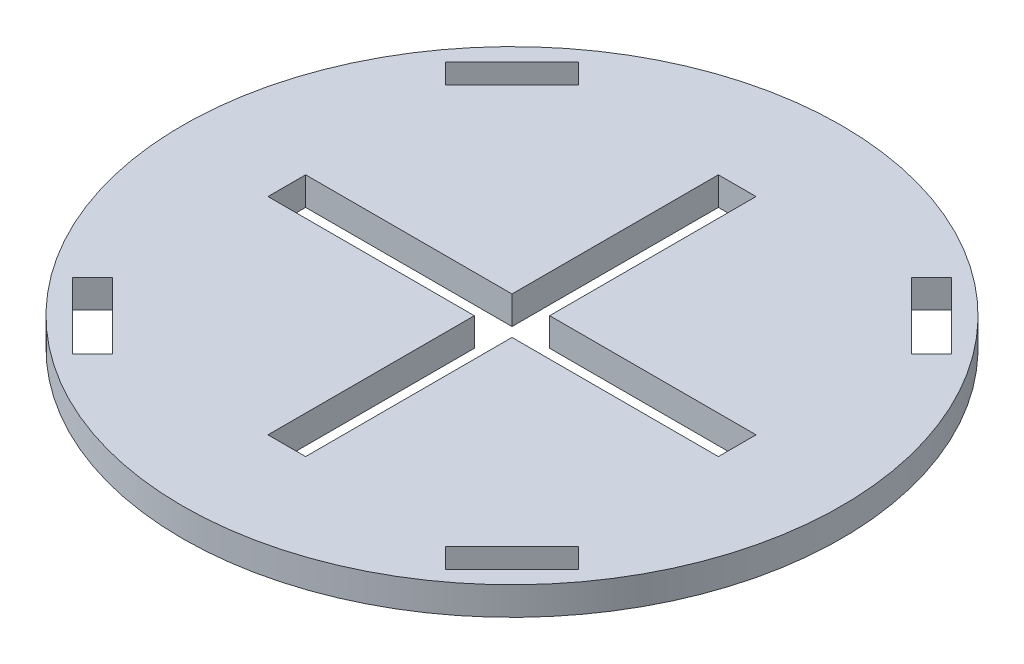
ISO-10303-21;
HEADER;
FILE_DESCRIPTION(('STEP AP214'),'2;1');
FILE_NAME('part.step','',(''),(''),'','','');
FILE_SCHEMA(('AUTOMOTIVE_DESIGN { 1 0 10303 214 1 1 1 1 }'));
ENDSEC;
DATA;
#1=APPLICATION_CONTEXT('core data for automotive mechanical design processes');
#2=APPLICATION_PROTOCOL_DEFINITION('international standard','automotive_design',2000,#1);
#3=PRODUCT_CONTEXT('',#1,'mechanical');
#4=PRODUCT('Part','Part','',(#3));
#5=PRODUCT_RELATED_PRODUCT_CATEGORY('part','',(#4));
#6=PRODUCT_DEFINITION_FORMATION('','',#4);
#7=PRODUCT_DEFINITION_CONTEXT('part definition',#1,'design');
#8=PRODUCT_DEFINITION('design','',#6,#7);
#9=PRODUCT_DEFINITION_SHAPE('','',#8);
#10=(LENGTH_UNIT() NAMED_UNIT(*) SI_UNIT(.MILLI.,.METRE.));
#11=(NAMED_UNIT(*) PLANE_ANGLE_UNIT() SI_UNIT($,.RADIAN.));
#12=(NAMED_UNIT(*) SI_UNIT($,.STERADIAN.) SOLID_ANGLE_UNIT());
#13=UNCERTAINTY_MEASURE_WITH_UNIT(LENGTH_MEASURE(1.E-05),#10,'distance_accuracy_value','');
#14=(GEOMETRIC_REPRESENTATION_CONTEXT(3) GLOBAL_UNCERTAINTY_ASSIGNED_CONTEXT((#13)) GLOBAL_UNIT_ASSIGNED_CONTEXT((#10,
#11,#12)) REPRESENTATION_CONTEXT('',''));
#15=CARTESIAN_POINT('',(0.,0.,0.));
#16=DIRECTION('',(0.,0.,1.));
#17=DIRECTION('',(1.,0.,0.));
#18=AXIS2_PLACEMENT_3D('',#15,#16,#17);
#19=CARTESIAN_POINT('',(0.,3.,0.));
#20=DIRECTION('',(0.,-1.,0.));
#21=DIRECTION('',(0.,0.,-1.));
#22=AXIS2_PLACEMENT_3D('',#19,#20,#21);
#23=CYLINDRICAL_SURFACE('',#22,35.);
#24=CARTESIAN_POINT('',(0.,3.,0.));
#25=DIRECTION('',(0.,1.,0.));
#26=DIRECTION('',(0.,0.,1.));
#27=AXIS2_PLACEMENT_3D('',#24,#25,#26);
#28=CIRCLE('',#27,35.);
#29=CARTESIAN_POINT('',(0.,3.,35.));
#30=VERTEX_POINT('',#29);
#31=EDGE_CURVE('E11',#30,#30,#28,.T.);
#32=ORIENTED_EDGE('',*,*,#31,.F.);
#33=EDGE_LOOP('',(#32));
#34=FACE_BOUND('',#33,.T.);
#35=CARTESIAN_POINT('',(0.,0.,0.));
#36=DIRECTION('',(0.,1.,0.));
#37=DIRECTION('',(0.,0.,1.));
#38=AXIS2_PLACEMENT_3D('',#35,#36,#37);
#39=CIRCLE('',#38,35.);
#40=CARTESIAN_POINT('',(0.,0.,35.));
#41=VERTEX_POINT('',#40);
#42=EDGE_CURVE('E36',#41,#41,#39,.T.);
#43=ORIENTED_EDGE('',*,*,#42,.T.);
#44=EDGE_LOOP('',(#43));
#45=FACE_BOUND('',#44,.T.);
#46=ADVANCED_FACE('F33',(#34,#45),#23,.T.);
#47=CARTESIAN_POINT('',(0.,3.,0.));
#48=DIRECTION('',(0.,1.,0.));
#49=DIRECTION('',(0.,0.,1.));
#50=AXIS2_PLACEMENT_3D('',#47,#48,#49);
#51=PLANE('',#50);
#52=DIRECTION('',(0.707106781186539,0.,0.707106781186556));
#53=VECTOR('',#52,1.);
#54=CARTESIAN_POINT('',(-26.8700576850886,3.,-19.7989898732236));
#55=LINE('',#54,#53);
#56=CARTESIAN_POINT('',(-26.8700576850886,3.,-19.7989898732236));
#57=VERTEX_POINT('',#56);
#58=CARTESIAN_POINT('',(-24.748737341529,3.,-17.677669529664));
#59=VERTEX_POINT('',#58);
#60=EDGE_CURVE('E47',#57,#59,#55,.T.);
#61=ORIENTED_EDGE('',*,*,#60,.F.);
#62=DIRECTION('',(-0.707106781186555,0.,0.70710678118654));
#63=VECTOR('',#62,1.);
#64=CARTESIAN_POINT('',(-26.8700576850886,3.,-19.7989898732236));
#65=LINE('',#64,#63);
#66=CARTESIAN_POINT('',(-19.798989873223,3.,-26.870057685089));
#67=VERTEX_POINT('',#66);
#68=EDGE_CURVE('E296',#67,#57,#65,.T.);
#69=ORIENTED_EDGE('',*,*,#68,.F.);
#70=DIRECTION('',(-0.70710678118654,0.,-0.707106781186555));
#71=VECTOR('',#70,1.);
#72=CARTESIAN_POINT('',(-19.798989873223,3.,-26.870057685089));
#73=LINE('',#72,#71);
#74=CARTESIAN_POINT('',(-17.6776695296634,3.,-24.7487373415293));
#75=VERTEX_POINT('',#74);
#76=EDGE_CURVE('E310',#75,#67,#73,.T.);
#77=ORIENTED_EDGE('',*,*,#76,.F.);
#78=DIRECTION('',(0.707106781186555,0.,-0.70710678118654));
#79=VECTOR('',#78,1.);
#80=CARTESIAN_POINT('',(-24.748737341529,3.,-17.677669529664));
#81=LINE('',#80,#79);
#82=EDGE_CURVE('E307',#59,#75,#81,.T.);
#83=ORIENTED_EDGE('',*,*,#82,.F.);
#84=EDGE_LOOP('',(#61,#69,#77,#83));
#85=FACE_BOUND('',#84,.T.);
#86=DIRECTION('',(0.707106781186553,0.,-0.707106781186542));
#87=VECTOR('',#86,1.);
#88=CARTESIAN_POINT('',(-19.7989898732235,3.,26.8700576850887));
#89=LINE('',#88,#87);
#90=CARTESIAN_POINT('',(-19.7989898732235,3.,26.8700576850887));
#91=VERTEX_POINT('',#90);
#92=CARTESIAN_POINT('',(-17.6776695296639,3.,24.748737341529));
#93=VERTEX_POINT('',#92);
#94=EDGE_CURVE('E55',#91,#93,#89,.T.);
#95=ORIENTED_EDGE('',*,*,#94,.F.);
#96=DIRECTION('',(0.707106781186543,0.,0.707106781186552));
#97=VECTOR('',#96,1.);
#98=CARTESIAN_POINT('',(-19.7989898732235,3.,26.8700576850887));
#99=LINE('',#98,#97);
#100=CARTESIAN_POINT('',(-26.8700576850889,3.,19.7989898732231));
#101=VERTEX_POINT('',#100);
#102=EDGE_CURVE('E266',#101,#91,#99,.T.);
#103=ORIENTED_EDGE('',*,*,#102,.F.);
#104=DIRECTION('',(-0.707106781186552,0.,0.707106781186543));
#105=VECTOR('',#104,1.);
#106=CARTESIAN_POINT('',(-26.8700576850889,3.,19.7989898732231));
#107=LINE('',#106,#105);
#108=CARTESIAN_POINT('',(-24.7487373415293,3.,17.6776695296635));
#109=VERTEX_POINT('',#108);
#110=EDGE_CURVE('E281',#109,#101,#107,.T.);
#111=ORIENTED_EDGE('',*,*,#110,.F.);
#112=DIRECTION('',(-0.707106781186543,0.,-0.707106781186552));
#113=VECTOR('',#112,1.);
#114=CARTESIAN_POINT('',(-17.6776695296639,3.,24.748737341529));
#115=LINE('',#114,#113);
#116=EDGE_CURVE('E277',#93,#109,#115,.T.);
#117=ORIENTED_EDGE('',*,*,#116,.F.);
#118=EDGE_LOOP('',(#95,#103,#111,#117));
#119=FACE_BOUND('',#118,.T.);
#120=DIRECTION('',(-0.707106781186545,0.,-0.70710678118655));
#121=VECTOR('',#120,1.);
#122=CARTESIAN_POINT('',(26.8700576850887,3.,19.7989898732234));
#123=LINE('',#122,#121);
#124=CARTESIAN_POINT('',(26.8700576850887,3.,19.7989898732234));
#125=VERTEX_POINT('',#124);
#126=CARTESIAN_POINT('',(24.7487373415291,3.,17.6776695296638));
#127=VERTEX_POINT('',#126);
#128=EDGE_CURVE('E224',#125,#127,#123,.T.);
#129=ORIENTED_EDGE('',*,*,#128,.F.);
#130=DIRECTION('',(0.70710678118655,0.,-0.707106781186545));
#131=VECTOR('',#130,1.);
#132=CARTESIAN_POINT('',(26.8700576850887,3.,19.7989898732234));
#133=LINE('',#132,#131);
#134=CARTESIAN_POINT('',(19.7989898732232,3.,26.8700576850889));
#135=VERTEX_POINT('',#134);
#136=EDGE_CURVE('E242',#135,#125,#133,.T.);
#137=ORIENTED_EDGE('',*,*,#136,.F.);
#138=DIRECTION('',(0.707106781186545,0.,0.70710678118655));
#139=VECTOR('',#138,1.);
#140=CARTESIAN_POINT('',(19.7989898732232,3.,26.8700576850889));
#141=LINE('',#140,#139);
#142=CARTESIAN_POINT('',(17.6776695296636,3.,24.7487373415292));
#143=VERTEX_POINT('',#142);
#144=EDGE_CURVE('E245',#143,#135,#141,.T.);
#145=ORIENTED_EDGE('',*,*,#144,.F.);
#146=DIRECTION('',(-0.70710678118655,0.,0.707106781186545));
#147=VECTOR('',#146,1.);
#148=CARTESIAN_POINT('',(24.7487373415291,3.,17.6776695296638));
#149=LINE('',#148,#147);
#150=EDGE_CURVE('E251',#127,#143,#149,.T.);
#151=ORIENTED_EDGE('',*,*,#150,.F.);
#152=EDGE_LOOP('',(#129,#137,#145,#151));
#153=FACE_BOUND('',#152,.T.);
#154=DIRECTION('',(-0.707106781186548,0.,0.707106781186547));
#155=VECTOR('',#154,1.);
#156=CARTESIAN_POINT('',(19.7989898732233,3.,-26.8700576850888));
#157=LINE('',#156,#155);
#158=CARTESIAN_POINT('',(19.7989898732233,3.,-26.8700576850888));
#159=VERTEX_POINT('',#158);
#160=CARTESIAN_POINT('',(17.6776695296637,3.,-24.7487373415292));
#161=VERTEX_POINT('',#160);
#162=EDGE_CURVE('E258',#159,#161,#157,.T.);
#163=ORIENTED_EDGE('',*,*,#162,.F.);
#164=DIRECTION('',(-0.707106781186548,0.,-0.707106781186547));
#165=VECTOR('',#164,1.);
#166=CARTESIAN_POINT('',(19.7989898732233,3.,-26.8700576850888));
#167=LINE('',#166,#165);
#168=CARTESIAN_POINT('',(26.8700576850888,3.,-19.7989898732233));
#169=VERTEX_POINT('',#168);
#170=EDGE_CURVE('E325',#169,#159,#167,.T.);
#171=ORIENTED_EDGE('',*,*,#170,.F.);
#172=DIRECTION('',(0.707106781186548,0.,-0.707106781186548));
#173=VECTOR('',#172,1.);
#174=CARTESIAN_POINT('',(26.8700576850888,3.,-19.7989898732233));
#175=LINE('',#174,#173);
#176=CARTESIAN_POINT('',(24.7487373415292,3.,-17.6776695296637));
#177=VERTEX_POINT('',#176);
#178=EDGE_CURVE('E339',#177,#169,#175,.T.);
#179=ORIENTED_EDGE('',*,*,#178,.F.);
#180=DIRECTION('',(0.707106781186548,0.,0.707106781186548));
#181=VECTOR('',#180,1.);
#182=CARTESIAN_POINT('',(17.6776695296637,3.,-24.7487373415292));
#183=LINE('',#182,#181);
#184=EDGE_CURVE('E336',#161,#177,#183,.T.);
#185=ORIENTED_EDGE('',*,*,#184,.F.);
#186=EDGE_LOOP('',(#163,#171,#179,#185));
#187=FACE_BOUND('',#186,.T.);
#188=DIRECTION('',(0.,0.,-1.));
#189=VECTOR('',#188,1.);
#190=CARTESIAN_POINT('',(2.,3.,2.00000000000003));
#191=LINE('',#190,#189);
#192=CARTESIAN_POINT('',(2.,3.,23.9165214862028));
#193=VERTEX_POINT('',#192);
#194=CARTESIAN_POINT('',(2.,3.,2.00000000000003));
#195=VERTEX_POINT('',#194);
#196=EDGE_CURVE('E346',#193,#195,#191,.T.);
#197=ORIENTED_EDGE('',*,*,#196,.F.);
#198=DIRECTION('',(1.,0.,0.));
#199=VECTOR('',#198,1.);
#200=CARTESIAN_POINT('',(-2.,3.,23.9165214862028));
#201=LINE('',#200,#199);
#202=CARTESIAN_POINT('',(-2.,3.,23.9165214862028));
#203=VERTEX_POINT('',#202);
#204=EDGE_CURVE('E357',#203,#193,#201,.T.);
#205=ORIENTED_EDGE('',*,*,#204,.F.);
#206=DIRECTION('',(0.,0.,1.));
#207=VECTOR('',#206,1.);
#208=CARTESIAN_POINT('',(-2.,3.,23.9165214862028));
#209=LINE('',#208,#207);
#210=CARTESIAN_POINT('',(-2.,3.,2.));
#211=VERTEX_POINT('',#210);
#212=EDGE_CURVE('E419',#211,#203,#209,.T.);
#213=ORIENTED_EDGE('',*,*,#212,.F.);
#214=DIRECTION('',(1.,0.,0.));
#215=VECTOR('',#214,1.);
#216=CARTESIAN_POINT('',(-2.,3.,2.));
#217=LINE('',#216,#215);
#218=CARTESIAN_POINT('',(-23.9165214862028,3.,2.));
#219=VERTEX_POINT('',#218);
#220=EDGE_CURVE('E416',#219,#211,#217,.T.);
#221=ORIENTED_EDGE('',*,*,#220,.F.);
#222=DIRECTION('',(0.,0.,1.));
#223=VECTOR('',#222,1.);
#224=CARTESIAN_POINT('',(-23.9165214862028,3.,2.));
#225=LINE('',#224,#223);
#226=CARTESIAN_POINT('',(-23.9165214862028,3.,-2.));
#227=VERTEX_POINT('',#226);
#228=EDGE_CURVE('E413',#227,#219,#225,.T.);
#229=ORIENTED_EDGE('',*,*,#228,.F.);
#230=DIRECTION('',(-1.,0.,0.));
#231=VECTOR('',#230,1.);
#232=CARTESIAN_POINT('',(-2.,3.,-2.));
#233=LINE('',#232,#231);
#234=CARTESIAN_POINT('',(-2.,3.,-2.));
#235=VERTEX_POINT('',#234);
#236=EDGE_CURVE('E410',#235,#227,#233,.T.);
#237=ORIENTED_EDGE('',*,*,#236,.F.);
#238=DIRECTION('',(0.,0.,1.));
#239=VECTOR('',#238,1.);
#240=CARTESIAN_POINT('',(-2.,3.,-23.9165214862028));
#241=LINE('',#240,#239);
#242=CARTESIAN_POINT('',(-2.,3.,-23.9165214862028));
#243=VERTEX_POINT('',#242);
#244=EDGE_CURVE('E407',#243,#235,#241,.T.);
#245=ORIENTED_EDGE('',*,*,#244,.F.);
#246=DIRECTION('',(-1.,0.,0.));
#247=VECTOR('',#246,1.);
#248=CARTESIAN_POINT('',(-2.,3.,-23.9165214862028));
#249=LINE('',#248,#247);
#250=CARTESIAN_POINT('',(2.,3.,-23.9165214862028));
#251=VERTEX_POINT('',#250);
#252=EDGE_CURVE('E404',#251,#243,#249,.T.);
#253=ORIENTED_EDGE('',*,*,#252,.F.);
#254=DIRECTION('',(0.,0.,-1.));
#255=VECTOR('',#254,1.);
#256=CARTESIAN_POINT('',(2.,3.,-23.9165214862028));
#257=LINE('',#256,#255);
#258=CARTESIAN_POINT('',(2.,3.,-2.00000000000003));
#259=VERTEX_POINT('',#258);
#260=EDGE_CURVE('E401',#259,#251,#257,.T.);
#261=ORIENTED_EDGE('',*,*,#260,.F.);
#262=DIRECTION('',(-1.,0.,0.));
#263=VECTOR('',#262,1.);
#264=CARTESIAN_POINT('',(2.,3.,-2.00000000000003));
#265=LINE('',#264,#263);
#266=CARTESIAN_POINT('',(23.9165214862028,3.,-2.00000000000002));
#267=VERTEX_POINT('',#266);
#268=EDGE_CURVE('E398',#267,#259,#265,.T.);
#269=ORIENTED_EDGE('',*,*,#268,.F.);
#270=DIRECTION('',(0.,0.,-1.));
#271=VECTOR('',#270,1.);
#272=CARTESIAN_POINT('',(23.9165214862028,3.,-2.00000000000002));
#273=LINE('',#272,#271);
#274=CARTESIAN_POINT('',(23.9165214862028,3.,2.00000000000002));
#275=VERTEX_POINT('',#274);
#276=EDGE_CURVE('E395',#275,#267,#273,.T.);
#277=ORIENTED_EDGE('',*,*,#276,.F.);
#278=DIRECTION('',(1.,0.,0.));
#279=VECTOR('',#278,1.);
#280=CARTESIAN_POINT('',(2.,3.,2.00000000000003));
#281=LINE('',#280,#279);
#282=EDGE_CURVE('E392',#195,#275,#281,.T.);
#283=ORIENTED_EDGE('',*,*,#282,.F.);
#284=EDGE_LOOP('',(#197,#205,#213,#221,#229,#237,#245,#253,#261,#269,#277,#283));
#285=FACE_BOUND('',#284,.T.);
#286=ORIENTED_EDGE('',*,*,#31,.T.);
#287=EDGE_LOOP('',(#286));
#288=FACE_BOUND('',#287,.T.);
#289=ADVANCED_FACE('F457',(#85,#119,#153,#187,#285,#288),#51,.T.);
#290=CARTESIAN_POINT('',(0.,0.,0.));
#291=DIRECTION('',(0.,1.,0.));
#292=DIRECTION('',(0.,0.,1.));
#293=AXIS2_PLACEMENT_3D('',#290,#291,#292);
#294=PLANE('',#293);
#295=DIRECTION('',(-0.707106781186555,0.,0.70710678118654));
#296=VECTOR('',#295,1.);
#297=CARTESIAN_POINT('',(-26.8700576850886,0.,-19.7989898732236));
#298=LINE('',#297,#296);
#299=CARTESIAN_POINT('',(-19.798989873223,0.,-26.870057685089));
#300=VERTEX_POINT('',#299);
#301=CARTESIAN_POINT('',(-26.8700576850886,0.,-19.7989898732236));
#302=VERTEX_POINT('',#301);
#303=EDGE_CURVE('E302',#300,#302,#298,.T.);
#304=ORIENTED_EDGE('',*,*,#303,.T.);
#305=DIRECTION('',(0.707106781186539,0.,0.707106781186556));
#306=VECTOR('',#305,1.);
#307=CARTESIAN_POINT('',(-26.8700576850886,0.,-19.7989898732236));
#308=LINE('',#307,#306);
#309=CARTESIAN_POINT('',(-24.748737341529,0.,-17.677669529664));
#310=VERTEX_POINT('',#309);
#311=EDGE_CURVE('E292',#302,#310,#308,.T.);
#312=ORIENTED_EDGE('',*,*,#311,.T.);
#313=DIRECTION('',(0.707106781186555,0.,-0.70710678118654));
#314=VECTOR('',#313,1.);
#315=CARTESIAN_POINT('',(-24.748737341529,0.,-17.677669529664));
#316=LINE('',#315,#314);
#317=CARTESIAN_POINT('',(-17.6776695296634,0.,-24.7487373415293));
#318=VERTEX_POINT('',#317);
#319=EDGE_CURVE('E295',#310,#318,#316,.T.);
#320=ORIENTED_EDGE('',*,*,#319,.T.);
#321=DIRECTION('',(-0.70710678118654,0.,-0.707106781186555));
#322=VECTOR('',#321,1.);
#323=CARTESIAN_POINT('',(-19.798989873223,0.,-26.870057685089));
#324=LINE('',#323,#322);
#325=EDGE_CURVE('E299',#318,#300,#324,.T.);
#326=ORIENTED_EDGE('',*,*,#325,.T.);
#327=EDGE_LOOP('',(#304,#312,#320,#326));
#328=FACE_BOUND('',#327,.T.);
#329=DIRECTION('',(0.707106781186543,0.,0.707106781186552));
#330=VECTOR('',#329,1.);
#331=CARTESIAN_POINT('',(-19.7989898732235,0.,26.8700576850887));
#332=LINE('',#331,#330);
#333=CARTESIAN_POINT('',(-26.8700576850889,0.,19.7989898732231));
#334=VERTEX_POINT('',#333);
#335=CARTESIAN_POINT('',(-19.7989898732235,0.,26.8700576850887));
#336=VERTEX_POINT('',#335);
#337=EDGE_CURVE('E272',#334,#336,#332,.T.);
#338=ORIENTED_EDGE('',*,*,#337,.T.);
#339=DIRECTION('',(0.707106781186553,0.,-0.707106781186542));
#340=VECTOR('',#339,1.);
#341=CARTESIAN_POINT('',(-19.7989898732235,0.,26.8700576850887));
#342=LINE('',#341,#340);
#343=CARTESIAN_POINT('',(-17.6776695296639,0.,24.748737341529));
#344=VERTEX_POINT('',#343);
#345=EDGE_CURVE('E262',#336,#344,#342,.T.);
#346=ORIENTED_EDGE('',*,*,#345,.T.);
#347=DIRECTION('',(-0.707106781186543,0.,-0.707106781186552));
#348=VECTOR('',#347,1.);
#349=CARTESIAN_POINT('',(-17.6776695296639,0.,24.748737341529));
#350=LINE('',#349,#348);
#351=CARTESIAN_POINT('',(-24.7487373415293,0.,17.6776695296635));
#352=VERTEX_POINT('',#351);
#353=EDGE_CURVE('E265',#344,#352,#350,.T.);
#354=ORIENTED_EDGE('',*,*,#353,.T.);
#355=DIRECTION('',(-0.707106781186552,0.,0.707106781186543));
#356=VECTOR('',#355,1.);
#357=CARTESIAN_POINT('',(-26.8700576850889,0.,19.7989898732231));
#358=LINE('',#357,#356);
#359=EDGE_CURVE('E269',#352,#334,#358,.T.);
#360=ORIENTED_EDGE('',*,*,#359,.T.);
#361=EDGE_LOOP('',(#338,#346,#354,#360));
#362=FACE_BOUND('',#361,.T.);
#363=DIRECTION('',(0.70710678118655,0.,-0.707106781186545));
#364=VECTOR('',#363,1.);
#365=CARTESIAN_POINT('',(26.8700576850887,0.,19.7989898732234));
#366=LINE('',#365,#364);
#367=CARTESIAN_POINT('',(19.7989898732232,0.,26.8700576850889));
#368=VERTEX_POINT('',#367);
#369=CARTESIAN_POINT('',(26.8700576850887,0.,19.7989898732234));
#370=VERTEX_POINT('',#369);
#371=EDGE_CURVE('E229',#368,#370,#366,.T.);
#372=ORIENTED_EDGE('',*,*,#371,.T.);
#373=DIRECTION('',(-0.707106781186545,0.,-0.70710678118655));
#374=VECTOR('',#373,1.);
#375=CARTESIAN_POINT('',(26.8700576850887,0.,19.7989898732234));
#376=LINE('',#375,#374);
#377=CARTESIAN_POINT('',(24.7487373415291,0.,17.6776695296638));
#378=VERTEX_POINT('',#377);
#379=EDGE_CURVE('E221',#370,#378,#376,.T.);
#380=ORIENTED_EDGE('',*,*,#379,.T.);
#381=DIRECTION('',(-0.70710678118655,0.,0.707106781186545));
#382=VECTOR('',#381,1.);
#383=CARTESIAN_POINT('',(24.7487373415291,0.,17.6776695296638));
#384=LINE('',#383,#382);
#385=CARTESIAN_POINT('',(17.6776695296636,0.,24.7487373415292));
#386=VERTEX_POINT('',#385);
#387=EDGE_CURVE('E233',#378,#386,#384,.T.);
#388=ORIENTED_EDGE('',*,*,#387,.T.);
#389=DIRECTION('',(0.707106781186545,0.,0.70710678118655));
#390=VECTOR('',#389,1.);
#391=CARTESIAN_POINT('',(19.7989898732232,0.,26.8700576850889));
#392=LINE('',#391,#390);
#393=EDGE_CURVE('E237',#386,#368,#392,.T.);
#394=ORIENTED_EDGE('',*,*,#393,.T.);
#395=EDGE_LOOP('',(#372,#380,#388,#394));
#396=FACE_BOUND('',#395,.T.);
#397=DIRECTION('',(-0.707106781186548,0.,-0.707106781186547));
#398=VECTOR('',#397,1.);
#399=CARTESIAN_POINT('',(19.7989898732233,0.,-26.8700576850888));
#400=LINE('',#399,#398);
#401=CARTESIAN_POINT('',(26.8700576850888,0.,-19.7989898732233));
#402=VERTEX_POINT('',#401);
#403=CARTESIAN_POINT('',(19.7989898732233,0.,-26.8700576850888));
#404=VERTEX_POINT('',#403);
#405=EDGE_CURVE('E331',#402,#404,#400,.T.);
#406=ORIENTED_EDGE('',*,*,#405,.T.);
#407=DIRECTION('',(-0.707106781186548,0.,0.707106781186547));
#408=VECTOR('',#407,1.);
#409=CARTESIAN_POINT('',(19.7989898732233,0.,-26.8700576850888));
#410=LINE('',#409,#408);
#411=CARTESIAN_POINT('',(17.6776695296637,0.,-24.7487373415292));
#412=VERTEX_POINT('',#411);
#413=EDGE_CURVE('E321',#404,#412,#410,.T.);
#414=ORIENTED_EDGE('',*,*,#413,.T.);
#415=DIRECTION('',(0.707106781186548,0.,0.707106781186548));
#416=VECTOR('',#415,1.);
#417=CARTESIAN_POINT('',(17.6776695296637,0.,-24.7487373415292));
#418=LINE('',#417,#416);
#419=CARTESIAN_POINT('',(24.7487373415292,0.,-17.6776695296637));
#420=VERTEX_POINT('',#419);
#421=EDGE_CURVE('E324',#412,#420,#418,.T.);
#422=ORIENTED_EDGE('',*,*,#421,.T.);
#423=DIRECTION('',(0.707106781186548,0.,-0.707106781186548));
#424=VECTOR('',#423,1.);
#425=CARTESIAN_POINT('',(26.8700576850888,0.,-19.7989898732233));
#426=LINE('',#425,#424);
#427=EDGE_CURVE('E328',#420,#402,#426,.T.);
#428=ORIENTED_EDGE('',*,*,#427,.T.);
#429=EDGE_LOOP('',(#406,#414,#422,#428));
#430=FACE_BOUND('',#429,.T.);
#431=DIRECTION('',(1.,0.,0.));
#432=VECTOR('',#431,1.);
#433=CARTESIAN_POINT('',(-2.,0.,23.9165214862028));
#434=LINE('',#433,#432);
#435=CARTESIAN_POINT('',(-2.,0.,23.9165214862028));
#436=VERTEX_POINT('',#435);
#437=CARTESIAN_POINT('',(2.,0.,23.9165214862028));
#438=VERTEX_POINT('',#437);
#439=EDGE_CURVE('E387',#436,#438,#434,.T.);
#440=ORIENTED_EDGE('',*,*,#439,.T.);
#441=DIRECTION('',(0.,0.,-1.));
#442=VECTOR('',#441,1.);
#443=CARTESIAN_POINT('',(2.,0.,2.00000000000003));
#444=LINE('',#443,#442);
#445=CARTESIAN_POINT('',(2.,0.,2.00000000000003));
#446=VERTEX_POINT('',#445);
#447=EDGE_CURVE('E353',#438,#446,#444,.T.);
#448=ORIENTED_EDGE('',*,*,#447,.T.);
#449=DIRECTION('',(1.,0.,0.));
#450=VECTOR('',#449,1.);
#451=CARTESIAN_POINT('',(2.,0.,2.00000000000003));
#452=LINE('',#451,#450);
#453=CARTESIAN_POINT('',(23.9165214862028,0.,2.00000000000002));
#454=VERTEX_POINT('',#453);
#455=EDGE_CURVE('E356',#446,#454,#452,.T.);
#456=ORIENTED_EDGE('',*,*,#455,.T.);
#457=DIRECTION('',(0.,0.,-1.));
#458=VECTOR('',#457,1.);
#459=CARTESIAN_POINT('',(23.9165214862028,0.,-2.00000000000002));
#460=LINE('',#459,#458);
#461=CARTESIAN_POINT('',(23.9165214862028,0.,-2.00000000000002));
#462=VERTEX_POINT('',#461);
#463=EDGE_CURVE('E360',#454,#462,#460,.T.);
#464=ORIENTED_EDGE('',*,*,#463,.T.);
#465=DIRECTION('',(-1.,0.,0.));
#466=VECTOR('',#465,1.);
#467=CARTESIAN_POINT('',(2.,0.,-2.00000000000003));
#468=LINE('',#467,#466);
#469=CARTESIAN_POINT('',(2.,0.,-2.00000000000003));
#470=VERTEX_POINT('',#469);
#471=EDGE_CURVE('E363',#462,#470,#468,.T.);
#472=ORIENTED_EDGE('',*,*,#471,.T.);
#473=DIRECTION('',(0.,0.,-1.));
#474=VECTOR('',#473,1.);
#475=CARTESIAN_POINT('',(2.,0.,-23.9165214862028));
#476=LINE('',#475,#474);
#477=CARTESIAN_POINT('',(2.,0.,-23.9165214862028));
#478=VERTEX_POINT('',#477);
#479=EDGE_CURVE('E366',#470,#478,#476,.T.);
#480=ORIENTED_EDGE('',*,*,#479,.T.);
#481=DIRECTION('',(-1.,0.,0.));
#482=VECTOR('',#481,1.);
#483=CARTESIAN_POINT('',(-2.,0.,-23.9165214862028));
#484=LINE('',#483,#482);
#485=CARTESIAN_POINT('',(-2.,0.,-23.9165214862028));
#486=VERTEX_POINT('',#485);
#487=EDGE_CURVE('E369',#478,#486,#484,.T.);
#488=ORIENTED_EDGE('',*,*,#487,.T.);
#489=DIRECTION('',(0.,0.,1.));
#490=VECTOR('',#489,1.);
#491=CARTESIAN_POINT('',(-2.,0.,-23.9165214862028));
#492=LINE('',#491,#490);
#493=CARTESIAN_POINT('',(-2.,0.,-2.));
#494=VERTEX_POINT('',#493);
#495=EDGE_CURVE('E372',#486,#494,#492,.T.);
#496=ORIENTED_EDGE('',*,*,#495,.T.);
#497=DIRECTION('',(-1.,0.,0.));
#498=VECTOR('',#497,1.);
#499=CARTESIAN_POINT('',(-2.,0.,-2.));
#500=LINE('',#499,#498);
#501=CARTESIAN_POINT('',(-23.9165214862028,0.,-2.));
#502=VERTEX_POINT('',#501);
#503=EDGE_CURVE('E375',#494,#502,#500,.T.);
#504=ORIENTED_EDGE('',*,*,#503,.T.);
#505=DIRECTION('',(0.,0.,1.));
#506=VECTOR('',#505,1.);
#507=CARTESIAN_POINT('',(-23.9165214862028,0.,2.));
#508=LINE('',#507,#506);
#509=CARTESIAN_POINT('',(-23.9165214862028,0.,2.));
#510=VERTEX_POINT('',#509);
#511=EDGE_CURVE('E378',#502,#510,#508,.T.);
#512=ORIENTED_EDGE('',*,*,#511,.T.);
#513=DIRECTION('',(1.,0.,0.));
#514=VECTOR('',#513,1.);
#515=CARTESIAN_POINT('',(-2.,0.,2.));
#516=LINE('',#515,#514);
#517=CARTESIAN_POINT('',(-2.,0.,2.));
#518=VERTEX_POINT('',#517);
#519=EDGE_CURVE('E381',#510,#518,#516,.T.);
#520=ORIENTED_EDGE('',*,*,#519,.T.);
#521=DIRECTION('',(0.,0.,1.));
#522=VECTOR('',#521,1.);
#523=CARTESIAN_POINT('',(-2.,0.,23.9165214862028));
#524=LINE('',#523,#522);
#525=EDGE_CURVE('E384',#518,#436,#524,.T.);
#526=ORIENTED_EDGE('',*,*,#525,.T.);
#527=EDGE_LOOP('',(#440,#448,#456,#464,#472,#480,#488,#496,#504,#512,#520,#526));
#528=FACE_BOUND('',#527,.T.);
#529=ORIENTED_EDGE('',*,*,#42,.F.);
#530=EDGE_LOOP('',(#529));
#531=FACE_BOUND('',#530,.T.);
#532=ADVANCED_FACE('F239',(#328,#362,#396,#430,#528,#531),#294,.F.);
#533=CARTESIAN_POINT('',(2.,0.,2.00000000000003));
#534=DIRECTION('',(1.,0.,0.));
#535=DIRECTION('',(0.,0.,-1.));
#536=AXIS2_PLACEMENT_3D('',#533,#534,#535);
#537=PLANE('',#536);
#538=ORIENTED_EDGE('',*,*,#196,.T.);
#539=DIRECTION('',(0.,1.,0.));
#540=VECTOR('',#539,1.);
#541=CARTESIAN_POINT('',(2.,0.,2.00000000000003));
#542=LINE('',#541,#540);
#543=EDGE_CURVE('E390',#446,#195,#542,.T.);
#544=ORIENTED_EDGE('',*,*,#543,.F.);
#545=ORIENTED_EDGE('',*,*,#447,.F.);
#546=DIRECTION('',(0.,1.,0.));
#547=VECTOR('',#546,1.);
#548=CARTESIAN_POINT('',(2.,0.,23.9165214862028));
#549=LINE('',#548,#547);
#550=EDGE_CURVE('E424',#438,#193,#549,.T.);
#551=ORIENTED_EDGE('',*,*,#550,.T.);
#552=EDGE_LOOP('',(#538,#544,#545,#551));
#553=FACE_BOUND('',#552,.T.);
#554=ADVANCED_FACE('F468',(#553),#537,.F.);
#555=CARTESIAN_POINT('',(-2.,0.,23.9165214862028));
#556=DIRECTION('',(0.,0.,1.));
#557=DIRECTION('',(1.,0.,0.));
#558=AXIS2_PLACEMENT_3D('',#555,#556,#557);
#559=PLANE('',#558);
#560=ORIENTED_EDGE('',*,*,#204,.T.);
#561=ORIENTED_EDGE('',*,*,#550,.F.);
#562=ORIENTED_EDGE('',*,*,#439,.F.);
#563=DIRECTION('',(0.,1.,0.));
#564=VECTOR('',#563,1.);
#565=CARTESIAN_POINT('',(-2.,0.,23.9165214862028));
#566=LINE('',#565,#564);
#567=EDGE_CURVE('E426',#436,#203,#566,.T.);
#568=ORIENTED_EDGE('',*,*,#567,.T.);
#569=EDGE_LOOP('',(#560,#561,#562,#568));
#570=FACE_BOUND('',#569,.T.);
#571=ADVANCED_FACE('F470',(#570),#559,.F.);
#572=CARTESIAN_POINT('',(-2.,0.,23.9165214862028));
#573=DIRECTION('',(-1.,0.,0.));
#574=DIRECTION('',(0.,0.,1.));
#575=AXIS2_PLACEMENT_3D('',#572,#573,#574);
#576=PLANE('',#575);
#577=ORIENTED_EDGE('',*,*,#212,.T.);
#578=ORIENTED_EDGE('',*,*,#567,.F.);
#579=ORIENTED_EDGE('',*,*,#525,.F.);
#580=DIRECTION('',(0.,1.,0.));
#581=VECTOR('',#580,1.);
#582=CARTESIAN_POINT('',(-2.,0.,2.));
#583=LINE('',#582,#581);
#584=EDGE_CURVE('E428',#518,#211,#583,.T.);
#585=ORIENTED_EDGE('',*,*,#584,.T.);
#586=EDGE_LOOP('',(#577,#578,#579,#585));
#587=FACE_BOUND('',#586,.T.);
#588=ADVANCED_FACE('F475',(#587),#576,.F.);
#589=CARTESIAN_POINT('',(-2.,0.,2.));
#590=DIRECTION('',(0.,0.,1.));
#591=DIRECTION('',(1.,0.,0.));
#592=AXIS2_PLACEMENT_3D('',#589,#590,#591);
#593=PLANE('',#592);
#594=ORIENTED_EDGE('',*,*,#220,.T.);
#595=ORIENTED_EDGE('',*,*,#584,.F.);
#596=ORIENTED_EDGE('',*,*,#519,.F.);
#597=DIRECTION('',(0.,1.,0.));
#598=VECTOR('',#597,1.);
#599=CARTESIAN_POINT('',(-23.9165214862028,0.,2.));
#600=LINE('',#599,#598);
#601=EDGE_CURVE('E430',#510,#219,#600,.T.);
#602=ORIENTED_EDGE('',*,*,#601,.T.);
#603=EDGE_LOOP('',(#594,#595,#596,#602));
#604=FACE_BOUND('',#603,.T.);
#605=ADVANCED_FACE('F479',(#604),#593,.F.);
#606=CARTESIAN_POINT('',(-23.9165214862028,0.,2.));
#607=DIRECTION('',(-1.,0.,0.));
#608=DIRECTION('',(0.,0.,1.));
#609=AXIS2_PLACEMENT_3D('',#606,#607,#608);
#610=PLANE('',#609);
#611=ORIENTED_EDGE('',*,*,#228,.T.);
#612=ORIENTED_EDGE('',*,*,#601,.F.);
#613=ORIENTED_EDGE('',*,*,#511,.F.);
#614=DIRECTION('',(0.,1.,0.));
#615=VECTOR('',#614,1.);
#616=CARTESIAN_POINT('',(-23.9165214862028,0.,-2.));
#617=LINE('',#616,#615);
#618=EDGE_CURVE('E432',#502,#227,#617,.T.);
#619=ORIENTED_EDGE('',*,*,#618,.T.);
#620=EDGE_LOOP('',(#611,#612,#613,#619));
#621=FACE_BOUND('',#620,.T.);
#622=ADVANCED_FACE('F482',(#621),#610,.F.);
#623=CARTESIAN_POINT('',(-2.,0.,-2.));
#624=DIRECTION('',(0.,0.,-1.));
#625=DIRECTION('',(-1.,0.,0.));
#626=AXIS2_PLACEMENT_3D('',#623,#624,#625);
#627=PLANE('',#626);
#628=ORIENTED_EDGE('',*,*,#236,.T.);
#629=ORIENTED_EDGE('',*,*,#618,.F.);
#630=ORIENTED_EDGE('',*,*,#503,.F.);
#631=DIRECTION('',(0.,1.,0.));
#632=VECTOR('',#631,1.);
#633=CARTESIAN_POINT('',(-2.,0.,-2.));
#634=LINE('',#633,#632);
#635=EDGE_CURVE('E434',#494,#235,#634,.T.);
#636=ORIENTED_EDGE('',*,*,#635,.T.);
#637=EDGE_LOOP('',(#628,#629,#630,#636));
#638=FACE_BOUND('',#637,.T.);
#639=ADVANCED_FACE('F487',(#638),#627,.F.);
#640=CARTESIAN_POINT('',(-2.,0.,-23.9165214862028));
#641=DIRECTION('',(-1.,0.,0.));
#642=DIRECTION('',(0.,0.,1.));
#643=AXIS2_PLACEMENT_3D('',#640,#641,#642);
#644=PLANE('',#643);
#645=ORIENTED_EDGE('',*,*,#244,.T.);
#646=ORIENTED_EDGE('',*,*,#635,.F.);
#647=ORIENTED_EDGE('',*,*,#495,.F.);
#648=DIRECTION('',(0.,1.,0.));
#649=VECTOR('',#648,1.);
#650=CARTESIAN_POINT('',(-2.,0.,-23.9165214862028));
#651=LINE('',#650,#649);
#652=EDGE_CURVE('E436',#486,#243,#651,.T.);
#653=ORIENTED_EDGE('',*,*,#652,.T.);
#654=EDGE_LOOP('',(#645,#646,#647,#653));
#655=FACE_BOUND('',#654,.T.);
#656=ADVANCED_FACE('F491',(#655),#644,.F.);
#657=CARTESIAN_POINT('',(-2.,0.,-23.9165214862028));
#658=DIRECTION('',(0.,0.,-1.));
#659=DIRECTION('',(-1.,0.,0.));
#660=AXIS2_PLACEMENT_3D('',#657,#658,#659);
#661=PLANE('',#660);
#662=ORIENTED_EDGE('',*,*,#252,.T.);
#663=ORIENTED_EDGE('',*,*,#652,.F.);
#664=ORIENTED_EDGE('',*,*,#487,.F.);
#665=DIRECTION('',(0.,1.,0.));
#666=VECTOR('',#665,1.);
#667=CARTESIAN_POINT('',(2.,0.,-23.9165214862028));
#668=LINE('',#667,#666);
#669=EDGE_CURVE('E438',#478,#251,#668,.T.);
#670=ORIENTED_EDGE('',*,*,#669,.T.);
#671=EDGE_LOOP('',(#662,#663,#664,#670));
#672=FACE_BOUND('',#671,.T.);
#673=ADVANCED_FACE('F494',(#672),#661,.F.);
#674=CARTESIAN_POINT('',(2.,0.,-23.9165214862028));
#675=DIRECTION('',(1.,0.,0.));
#676=DIRECTION('',(0.,0.,-1.));
#677=AXIS2_PLACEMENT_3D('',#674,#675,#676);
#678=PLANE('',#677);
#679=ORIENTED_EDGE('',*,*,#260,.T.);
#680=ORIENTED_EDGE('',*,*,#669,.F.);
#681=ORIENTED_EDGE('',*,*,#479,.F.);
#682=DIRECTION('',(0.,1.,0.));
#683=VECTOR('',#682,1.);
#684=CARTESIAN_POINT('',(2.,0.,-2.00000000000003));
#685=LINE('',#684,#683);
#686=EDGE_CURVE('E440',#470,#259,#685,.T.);
#687=ORIENTED_EDGE('',*,*,#686,.T.);
#688=EDGE_LOOP('',(#679,#680,#681,#687));
#689=FACE_BOUND('',#688,.T.);
#690=ADVANCED_FACE('F496',(#689),#678,.F.);
#691=CARTESIAN_POINT('',(2.,0.,-2.00000000000003));
#692=DIRECTION('',(0.,0.,-1.));
#693=DIRECTION('',(-1.,0.,0.));
#694=AXIS2_PLACEMENT_3D('',#691,#692,#693);
#695=PLANE('',#694);
#696=ORIENTED_EDGE('',*,*,#268,.T.);
#697=ORIENTED_EDGE('',*,*,#686,.F.);
#698=ORIENTED_EDGE('',*,*,#471,.F.);
#699=DIRECTION('',(0.,1.,0.));
#700=VECTOR('',#699,1.);
#701=CARTESIAN_POINT('',(23.9165214862028,0.,-2.00000000000002));
#702=LINE('',#701,#700);
#703=EDGE_CURVE('E442',#462,#267,#702,.T.);
#704=ORIENTED_EDGE('',*,*,#703,.T.);
#705=EDGE_LOOP('',(#696,#697,#698,#704));
#706=FACE_BOUND('',#705,.T.);
#707=ADVANCED_FACE('F499',(#706),#695,.F.);
#708=CARTESIAN_POINT('',(23.9165214862028,0.,-2.00000000000002));
#709=DIRECTION('',(1.,0.,0.));
#710=DIRECTION('',(0.,0.,-1.));
#711=AXIS2_PLACEMENT_3D('',#708,#709,#710);
#712=PLANE('',#711);
#713=ORIENTED_EDGE('',*,*,#276,.T.);
#714=ORIENTED_EDGE('',*,*,#703,.F.);
#715=ORIENTED_EDGE('',*,*,#463,.F.);
#716=DIRECTION('',(0.,1.,0.));
#717=VECTOR('',#716,1.);
#718=CARTESIAN_POINT('',(23.9165214862028,0.,2.00000000000002));
#719=LINE('',#718,#717);
#720=EDGE_CURVE('E444',#454,#275,#719,.T.);
#721=ORIENTED_EDGE('',*,*,#720,.T.);
#722=EDGE_LOOP('',(#713,#714,#715,#721));
#723=FACE_BOUND('',#722,.T.);
#724=ADVANCED_FACE('F463',(#723),#712,.F.);
#725=CARTESIAN_POINT('',(2.,0.,2.00000000000003));
#726=DIRECTION('',(0.,0.,1.));
#727=DIRECTION('',(1.,0.,0.));
#728=AXIS2_PLACEMENT_3D('',#725,#726,#727);
#729=PLANE('',#728);
#730=ORIENTED_EDGE('',*,*,#282,.T.);
#731=ORIENTED_EDGE('',*,*,#720,.F.);
#732=ORIENTED_EDGE('',*,*,#455,.F.);
#733=ORIENTED_EDGE('',*,*,#543,.T.);
#734=EDGE_LOOP('',(#730,#731,#732,#733));
#735=FACE_BOUND('',#734,.T.);
#736=ADVANCED_FACE('F450',(#735),#729,.F.);
#737=CARTESIAN_POINT('',(19.7989898732233,0.,-26.8700576850888));
#738=DIRECTION('',(-0.707106781186547,0.,-0.707106781186548));
#739=DIRECTION('',(-0.707106781186548,0.,0.707106781186547));
#740=AXIS2_PLACEMENT_3D('',#737,#738,#739);
#741=PLANE('',#740);
#742=ORIENTED_EDGE('',*,*,#162,.T.);
#743=DIRECTION('',(0.,1.,0.));
#744=VECTOR('',#743,1.);
#745=CARTESIAN_POINT('',(17.6776695296637,0.,-24.7487373415292));
#746=LINE('',#745,#744);
#747=EDGE_CURVE('E334',#412,#161,#746,.T.);
#748=ORIENTED_EDGE('',*,*,#747,.F.);
#749=ORIENTED_EDGE('',*,*,#413,.F.);
#750=DIRECTION('',(0.,1.,0.));
#751=VECTOR('',#750,1.);
#752=CARTESIAN_POINT('',(19.7989898732233,0.,-26.8700576850888));
#753=LINE('',#752,#751);
#754=EDGE_CURVE('E344',#404,#159,#753,.T.);
#755=ORIENTED_EDGE('',*,*,#754,.T.);
#756=EDGE_LOOP('',(#742,#748,#749,#755));
#757=FACE_BOUND('',#756,.T.);
#758=ADVANCED_FACE('F528',(#757),#741,.F.);
#759=CARTESIAN_POINT('',(19.7989898732233,0.,-26.8700576850888));
#760=DIRECTION('',(0.707106781186547,0.,-0.707106781186548));
#761=DIRECTION('',(-0.707106781186548,0.,-0.707106781186547));
#762=AXIS2_PLACEMENT_3D('',#759,#760,#761);
#763=PLANE('',#762);
#764=ORIENTED_EDGE('',*,*,#170,.T.);
#765=ORIENTED_EDGE('',*,*,#754,.F.);
#766=ORIENTED_EDGE('',*,*,#405,.F.);
#767=DIRECTION('',(0.,1.,0.));
#768=VECTOR('',#767,1.);
#769=CARTESIAN_POINT('',(26.8700576850888,0.,-19.7989898732233));
#770=LINE('',#769,#768);
#771=EDGE_CURVE('E347',#402,#169,#770,.T.);
#772=ORIENTED_EDGE('',*,*,#771,.T.);
#773=EDGE_LOOP('',(#764,#765,#766,#772));
#774=FACE_BOUND('',#773,.T.);
#775=ADVANCED_FACE('F532',(#774),#763,.F.);
#776=CARTESIAN_POINT('',(26.8700576850888,0.,-19.7989898732233));
#777=DIRECTION('',(0.707106781186547,0.,0.707106781186547));
#778=DIRECTION('',(0.707106781186548,0.,-0.707106781186548));
#779=AXIS2_PLACEMENT_3D('',#776,#777,#778);
#780=PLANE('',#779);
#781=ORIENTED_EDGE('',*,*,#178,.T.);
#782=ORIENTED_EDGE('',*,*,#771,.F.);
#783=ORIENTED_EDGE('',*,*,#427,.F.);
#784=DIRECTION('',(0.,1.,0.));
#785=VECTOR('',#784,1.);
#786=CARTESIAN_POINT('',(24.7487373415292,0.,-17.6776695296637));
#787=LINE('',#786,#785);
#788=EDGE_CURVE('E349',#420,#177,#787,.T.);
#789=ORIENTED_EDGE('',*,*,#788,.T.);
#790=EDGE_LOOP('',(#781,#782,#783,#789));
#791=FACE_BOUND('',#790,.T.);
#792=ADVANCED_FACE('F538',(#791),#780,.F.);
#793=CARTESIAN_POINT('',(17.6776695296637,0.,-24.7487373415292));
#794=DIRECTION('',(-0.707106781186547,0.,0.707106781186547));
#795=DIRECTION('',(0.707106781186548,0.,0.707106781186548));
#796=AXIS2_PLACEMENT_3D('',#793,#794,#795);
#797=PLANE('',#796);
#798=ORIENTED_EDGE('',*,*,#184,.T.);
#799=ORIENTED_EDGE('',*,*,#788,.F.);
#800=ORIENTED_EDGE('',*,*,#421,.F.);
#801=ORIENTED_EDGE('',*,*,#747,.T.);
#802=EDGE_LOOP('',(#798,#799,#800,#801));
#803=FACE_BOUND('',#802,.T.);
#804=ADVANCED_FACE('F543',(#803),#797,.F.);
#805=CARTESIAN_POINT('',(26.8700576850887,0.,19.7989898732234));
#806=DIRECTION('',(0.70710678118655,0.,-0.707106781186545));
#807=DIRECTION('',(-0.707106781186545,0.,-0.70710678118655));
#808=AXIS2_PLACEMENT_3D('',#805,#806,#807);
#809=PLANE('',#808);
#810=ORIENTED_EDGE('',*,*,#128,.T.);
#811=DIRECTION('',(0.,1.,0.));
#812=VECTOR('',#811,1.);
#813=CARTESIAN_POINT('',(24.7487373415291,0.,17.6776695296638));
#814=LINE('',#813,#812);
#815=EDGE_CURVE('E217',#378,#127,#814,.T.);
#816=ORIENTED_EDGE('',*,*,#815,.F.);
#817=ORIENTED_EDGE('',*,*,#379,.F.);
#818=DIRECTION('',(0.,1.,0.));
#819=VECTOR('',#818,1.);
#820=CARTESIAN_POINT('',(26.8700576850887,0.,19.7989898732234));
#821=LINE('',#820,#819);
#822=EDGE_CURVE('E256',#370,#125,#821,.T.);
#823=ORIENTED_EDGE('',*,*,#822,.T.);
#824=EDGE_LOOP('',(#810,#816,#817,#823));
#825=FACE_BOUND('',#824,.T.);
#826=ADVANCED_FACE('F219',(#825),#809,.F.);
#827=CARTESIAN_POINT('',(26.8700576850887,0.,19.7989898732234));
#828=DIRECTION('',(0.707106781186545,0.,0.70710678118655));
#829=DIRECTION('',(0.70710678118655,0.,-0.707106781186545));
#830=AXIS2_PLACEMENT_3D('',#827,#828,#829);
#831=PLANE('',#830);
#832=ORIENTED_EDGE('',*,*,#136,.T.);
#833=ORIENTED_EDGE('',*,*,#822,.F.);
#834=ORIENTED_EDGE('',*,*,#371,.F.);
#835=DIRECTION('',(0.,1.,0.));
#836=VECTOR('',#835,1.);
#837=CARTESIAN_POINT('',(19.7989898732232,0.,26.8700576850889));
#838=LINE('',#837,#836);
#839=EDGE_CURVE('E259',#368,#135,#838,.T.);
#840=ORIENTED_EDGE('',*,*,#839,.T.);
#841=EDGE_LOOP('',(#832,#833,#834,#840));
#842=FACE_BOUND('',#841,.T.);
#843=ADVANCED_FACE('F627',(#842),#831,.F.);
#844=CARTESIAN_POINT('',(19.7989898732232,0.,26.8700576850889));
#845=DIRECTION('',(-0.70710678118655,0.,0.707106781186545));
#846=DIRECTION('',(0.707106781186545,0.,0.70710678118655));
#847=AXIS2_PLACEMENT_3D('',#844,#845,#846);
#848=PLANE('',#847);
#849=ORIENTED_EDGE('',*,*,#144,.T.);
#850=ORIENTED_EDGE('',*,*,#839,.F.);
#851=ORIENTED_EDGE('',*,*,#393,.F.);
#852=DIRECTION('',(0.,1.,0.));
#853=VECTOR('',#852,1.);
#854=CARTESIAN_POINT('',(17.6776695296636,0.,24.7487373415292));
#855=LINE('',#854,#853);
#856=EDGE_CURVE('E228',#386,#143,#855,.T.);
#857=ORIENTED_EDGE('',*,*,#856,.T.);
#858=EDGE_LOOP('',(#849,#850,#851,#857));
#859=FACE_BOUND('',#858,.T.);
#860=ADVANCED_FACE('F636',(#859),#848,.F.);
#861=CARTESIAN_POINT('',(24.7487373415291,0.,17.6776695296638));
#862=DIRECTION('',(-0.707106781186545,0.,-0.70710678118655));
#863=DIRECTION('',(-0.70710678118655,0.,0.707106781186545));
#864=AXIS2_PLACEMENT_3D('',#861,#862,#863);
#865=PLANE('',#864);
#866=ORIENTED_EDGE('',*,*,#150,.T.);
#867=ORIENTED_EDGE('',*,*,#856,.F.);
#868=ORIENTED_EDGE('',*,*,#387,.F.);
#869=ORIENTED_EDGE('',*,*,#815,.T.);
#870=EDGE_LOOP('',(#866,#867,#868,#869));
#871=FACE_BOUND('',#870,.T.);
#872=ADVANCED_FACE('F234',(#871),#865,.F.);
#873=CARTESIAN_POINT('',(-19.7989898732235,0.,26.8700576850887));
#874=DIRECTION('',(0.707106781186542,0.,0.707106781186553));
#875=DIRECTION('',(0.707106781186553,0.,-0.707106781186542));
#876=AXIS2_PLACEMENT_3D('',#873,#874,#875);
#877=PLANE('',#876);
#878=ORIENTED_EDGE('',*,*,#94,.T.);
#879=DIRECTION('',(0.,1.,0.));
#880=VECTOR('',#879,1.);
#881=CARTESIAN_POINT('',(-17.6776695296639,0.,24.748737341529));
#882=LINE('',#881,#880);
#883=EDGE_CURVE('E275',#344,#93,#882,.T.);
#884=ORIENTED_EDGE('',*,*,#883,.F.);
#885=ORIENTED_EDGE('',*,*,#345,.F.);
#886=DIRECTION('',(0.,1.,0.));
#887=VECTOR('',#886,1.);
#888=CARTESIAN_POINT('',(-19.7989898732235,0.,26.8700576850887));
#889=LINE('',#888,#887);
#890=EDGE_CURVE('E252',#336,#91,#889,.T.);
#891=ORIENTED_EDGE('',*,*,#890,.T.);
#892=EDGE_LOOP('',(#878,#884,#885,#891));
#893=FACE_BOUND('',#892,.T.);
#894=ADVANCED_FACE('F655',(#893),#877,.F.);
#895=CARTESIAN_POINT('',(-19.7989898732235,0.,26.8700576850887));
#896=DIRECTION('',(-0.707106781186552,0.,0.707106781186543));
#897=DIRECTION('',(0.707106781186543,0.,0.707106781186552));
#898=AXIS2_PLACEMENT_3D('',#895,#896,#897);
#899=PLANE('',#898);
#900=ORIENTED_EDGE('',*,*,#102,.T.);
#901=ORIENTED_EDGE('',*,*,#890,.F.);
#902=ORIENTED_EDGE('',*,*,#337,.F.);
#903=DIRECTION('',(0.,1.,0.));
#904=VECTOR('',#903,1.);
#905=CARTESIAN_POINT('',(-26.8700576850889,0.,19.7989898732231));
#906=LINE('',#905,#904);
#907=EDGE_CURVE('E287',#334,#101,#906,.T.);
#908=ORIENTED_EDGE('',*,*,#907,.T.);
#909=EDGE_LOOP('',(#900,#901,#902,#908));
#910=FACE_BOUND('',#909,.T.);
#911=ADVANCED_FACE('F664',(#910),#899,.F.);
#912=CARTESIAN_POINT('',(-26.8700576850889,0.,19.7989898732231));
#913=DIRECTION('',(-0.707106781186543,0.,-0.707106781186552));
#914=DIRECTION('',(-0.707106781186552,0.,0.707106781186543));
#915=AXIS2_PLACEMENT_3D('',#912,#913,#914);
#916=PLANE('',#915);
#917=ORIENTED_EDGE('',*,*,#110,.T.);
#918=ORIENTED_EDGE('',*,*,#907,.F.);
#919=ORIENTED_EDGE('',*,*,#359,.F.);
#920=DIRECTION('',(0.,1.,0.));
#921=VECTOR('',#920,1.);
#922=CARTESIAN_POINT('',(-24.7487373415293,0.,17.6776695296635));
#923=LINE('',#922,#921);
#924=EDGE_CURVE('E289',#352,#109,#923,.T.);
#925=ORIENTED_EDGE('',*,*,#924,.T.);
#926=EDGE_LOOP('',(#917,#918,#919,#925));
#927=FACE_BOUND('',#926,.T.);
#928=ADVANCED_FACE('F673',(#927),#916,.F.);
#929=CARTESIAN_POINT('',(-17.6776695296639,0.,24.748737341529));
#930=DIRECTION('',(0.707106781186552,0.,-0.707106781186543));
#931=DIRECTION('',(-0.707106781186543,0.,-0.707106781186552));
#932=AXIS2_PLACEMENT_3D('',#929,#930,#931);
#933=PLANE('',#932);
#934=ORIENTED_EDGE('',*,*,#116,.T.);
#935=ORIENTED_EDGE('',*,*,#924,.F.);
#936=ORIENTED_EDGE('',*,*,#353,.F.);
#937=ORIENTED_EDGE('',*,*,#883,.T.);
#938=EDGE_LOOP('',(#934,#935,#936,#937));
#939=FACE_BOUND('',#938,.T.);
#940=ADVANCED_FACE('F683',(#939),#933,.F.);
#941=CARTESIAN_POINT('',(-26.8700576850886,0.,-19.7989898732236));
#942=DIRECTION('',(-0.707106781186556,0.,0.707106781186539));
#943=DIRECTION('',(0.707106781186539,0.,0.707106781186556));
#944=AXIS2_PLACEMENT_3D('',#941,#942,#943);
#945=PLANE('',#944);
#946=ORIENTED_EDGE('',*,*,#60,.T.);
#947=DIRECTION('',(0.,1.,0.));
#948=VECTOR('',#947,1.);
#949=CARTESIAN_POINT('',(-24.748737341529,0.,-17.677669529664));
#950=LINE('',#949,#948);
#951=EDGE_CURVE('E305',#310,#59,#950,.T.);
#952=ORIENTED_EDGE('',*,*,#951,.F.);
#953=ORIENTED_EDGE('',*,*,#311,.F.);
#954=DIRECTION('',(0.,1.,0.));
#955=VECTOR('',#954,1.);
#956=CARTESIAN_POINT('',(-26.8700576850886,0.,-19.7989898732236));
#957=LINE('',#956,#955);
#958=EDGE_CURVE('E278',#302,#57,#957,.T.);
#959=ORIENTED_EDGE('',*,*,#958,.T.);
#960=EDGE_LOOP('',(#946,#952,#953,#959));
#961=FACE_BOUND('',#960,.T.);
#962=ADVANCED_FACE('F693',(#961),#945,.F.);
#963=CARTESIAN_POINT('',(-26.8700576850886,0.,-19.7989898732236));
#964=DIRECTION('',(-0.70710678118654,0.,-0.707106781186555));
#965=DIRECTION('',(-0.707106781186555,0.,0.70710678118654));
#966=AXIS2_PLACEMENT_3D('',#963,#964,#965);
#967=PLANE('',#966);
#968=ORIENTED_EDGE('',*,*,#68,.T.);
#969=ORIENTED_EDGE('',*,*,#958,.F.);
#970=ORIENTED_EDGE('',*,*,#303,.F.);
#971=DIRECTION('',(0.,1.,0.));
#972=VECTOR('',#971,1.);
#973=CARTESIAN_POINT('',(-19.798989873223,0.,-26.870057685089));
#974=LINE('',#973,#972);
#975=EDGE_CURVE('E316',#300,#67,#974,.T.);
#976=ORIENTED_EDGE('',*,*,#975,.T.);
#977=EDGE_LOOP('',(#968,#969,#970,#976));
#978=FACE_BOUND('',#977,.T.);
#979=ADVANCED_FACE('F703',(#978),#967,.F.);
#980=CARTESIAN_POINT('',(-19.798989873223,0.,-26.870057685089));
#981=DIRECTION('',(0.707106781186555,0.,-0.70710678118654));
#982=DIRECTION('',(-0.70710678118654,0.,-0.707106781186555));
#983=AXIS2_PLACEMENT_3D('',#980,#981,#982);
#984=PLANE('',#983);
#985=ORIENTED_EDGE('',*,*,#76,.T.);
#986=ORIENTED_EDGE('',*,*,#975,.F.);
#987=ORIENTED_EDGE('',*,*,#325,.F.);
#988=DIRECTION('',(0.,1.,0.));
#989=VECTOR('',#988,1.);
#990=CARTESIAN_POINT('',(-17.6776695296634,0.,-24.7487373415293));
#991=LINE('',#990,#989);
#992=EDGE_CURVE('E318',#318,#75,#991,.T.);
#993=ORIENTED_EDGE('',*,*,#992,.T.);
#994=EDGE_LOOP('',(#985,#986,#987,#993));
#995=FACE_BOUND('',#994,.T.);
#996=ADVANCED_FACE('F712',(#995),#984,.F.);
#997=CARTESIAN_POINT('',(-24.748737341529,0.,-17.677669529664));
#998=DIRECTION('',(0.70710678118654,0.,0.707106781186555));
#999=DIRECTION('',(0.707106781186555,0.,-0.70710678118654));
#1000=AXIS2_PLACEMENT_3D('',#997,#998,#999);
#1001=PLANE('',#1000);
#1002=ORIENTED_EDGE('',*,*,#82,.T.);
#1003=ORIENTED_EDGE('',*,*,#992,.F.);
#1004=ORIENTED_EDGE('',*,*,#319,.F.);
#1005=ORIENTED_EDGE('',*,*,#951,.T.);
#1006=EDGE_LOOP('',(#1002,#1003,#1004,#1005));
#1007=FACE_BOUND('',#1006,.T.);
#1008=ADVANCED_FACE('F722',(#1007),#1001,.F.);
#1009=CLOSED_SHELL('',(#46,#289,#532,#554,#571,#588,#605,#622,#639,#656,#673,#690,#707,#724,
#736,#758,#775,#792,#804,#826,#843,#860,#872,#894,#911,#928,#940,#962,#979,#996,#1008));
#1010=MANIFOLD_SOLID_BREP('B2',#1009);
#1011=ADVANCED_BREP_SHAPE_REPRESENTATION('',(#18,#1010),#14);
#1012=SHAPE_DEFINITION_REPRESENTATION(#9,#1011);
ENDSEC;
END-ISO-10303-21;
